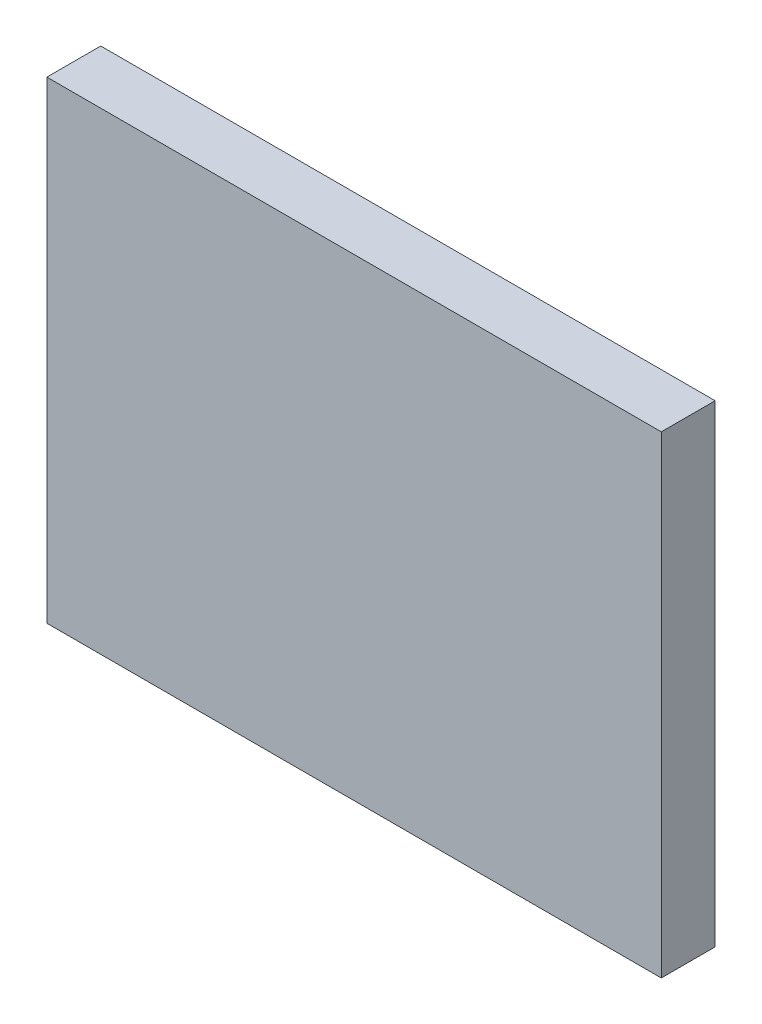
ISO-10303-21;
HEADER;
FILE_DESCRIPTION(('STEP AP214'),'2;1');
FILE_NAME('part.step','',(''),(''),'','','');
FILE_SCHEMA(('AUTOMOTIVE_DESIGN { 1 0 10303 214 1 1 1 1 }'));
ENDSEC;
DATA;
#1=APPLICATION_CONTEXT('core data for automotive mechanical design processes');
#2=APPLICATION_PROTOCOL_DEFINITION('international standard','automotive_design',2000,#1);
#3=PRODUCT_CONTEXT('',#1,'mechanical');
#4=PRODUCT('Part','Part','',(#3));
#5=PRODUCT_RELATED_PRODUCT_CATEGORY('part','',(#4));
#6=PRODUCT_DEFINITION_FORMATION('','',#4);
#7=PRODUCT_DEFINITION_CONTEXT('part definition',#1,'design');
#8=PRODUCT_DEFINITION('design','',#6,#7);
#9=PRODUCT_DEFINITION_SHAPE('','',#8);
#10=(LENGTH_UNIT() NAMED_UNIT(*) SI_UNIT(.MILLI.,.METRE.));
#11=(NAMED_UNIT(*) PLANE_ANGLE_UNIT() SI_UNIT($,.RADIAN.));
#12=(NAMED_UNIT(*) SI_UNIT($,.STERADIAN.) SOLID_ANGLE_UNIT());
#13=UNCERTAINTY_MEASURE_WITH_UNIT(LENGTH_MEASURE(1.E-05),#10,'distance_accuracy_value','');
#14=(GEOMETRIC_REPRESENTATION_CONTEXT(3) GLOBAL_UNCERTAINTY_ASSIGNED_CONTEXT((#13)) GLOBAL_UNIT_ASSIGNED_CONTEXT((#10,
#11,#12)) REPRESENTATION_CONTEXT('',''));
#15=CARTESIAN_POINT('',(0.,0.,0.));
#16=DIRECTION('',(0.,0.,1.));
#17=DIRECTION('',(1.,0.,0.));
#18=AXIS2_PLACEMENT_3D('',#15,#16,#17);
#19=CARTESIAN_POINT('',(57.0327334451584,43.9077528089888,10.));
#20=DIRECTION('',(-1.,0.,0.));
#21=DIRECTION('',(0.,0.,1.));
#22=AXIS2_PLACEMENT_3D('',#19,#20,#21);
#23=PLANE('',#22);
#24=DIRECTION('',(0.,1.,0.));
#25=VECTOR('',#24,1.);
#26=CARTESIAN_POINT('',(57.0327334451584,43.9077528089888,0.));
#27=LINE('',#26,#25);
#28=CARTESIAN_POINT('',(57.0327334451584,-43.9077528089888,0.));
#29=VERTEX_POINT('',#28);
#30=CARTESIAN_POINT('',(57.0327334451584,43.9077528089888,0.));
#31=VERTEX_POINT('',#30);
#32=EDGE_CURVE('E96',#29,#31,#27,.T.);
#33=ORIENTED_EDGE('',*,*,#32,.T.);
#34=DIRECTION('',(0.,0.,-1.));
#35=VECTOR('',#34,1.);
#36=CARTESIAN_POINT('',(57.0327334451584,43.9077528089888,10.));
#37=LINE('',#36,#35);
#38=CARTESIAN_POINT('',(57.0327334451584,43.9077528089888,10.));
#39=VERTEX_POINT('',#38);
#40=EDGE_CURVE('E11',#39,#31,#37,.T.);
#41=ORIENTED_EDGE('',*,*,#40,.F.);
#42=DIRECTION('',(0.,1.,0.));
#43=VECTOR('',#42,1.);
#44=CARTESIAN_POINT('',(57.0327334451584,43.9077528089888,10.));
#45=LINE('',#44,#43);
#46=CARTESIAN_POINT('',(57.0327334451584,-43.9077528089888,10.));
#47=VERTEX_POINT('',#46);
#48=EDGE_CURVE('E84',#47,#39,#45,.T.);
#49=ORIENTED_EDGE('',*,*,#48,.F.);
#50=DIRECTION('',(0.,0.,-1.));
#51=VECTOR('',#50,1.);
#52=CARTESIAN_POINT('',(57.0327334451584,-43.9077528089888,10.));
#53=LINE('',#52,#51);
#54=EDGE_CURVE('E92',#47,#29,#53,.T.);
#55=ORIENTED_EDGE('',*,*,#54,.T.);
#56=EDGE_LOOP('',(#33,#41,#49,#55));
#57=FACE_BOUND('',#56,.T.);
#58=ADVANCED_FACE('F33',(#57),#23,.F.);
#59=CARTESIAN_POINT('',(-57.0327334451584,43.9077528089888,10.));
#60=DIRECTION('',(0.,-1.,0.));
#61=DIRECTION('',(0.,0.,-1.));
#62=AXIS2_PLACEMENT_3D('',#59,#60,#61);
#63=PLANE('',#62);
#64=DIRECTION('',(-1.,0.,0.));
#65=VECTOR('',#64,1.);
#66=CARTESIAN_POINT('',(-57.0327334451584,43.9077528089888,0.));
#67=LINE('',#66,#65);
#68=CARTESIAN_POINT('',(-57.0327334451584,43.9077528089888,0.));
#69=VERTEX_POINT('',#68);
#70=EDGE_CURVE('E88',#31,#69,#67,.T.);
#71=ORIENTED_EDGE('',*,*,#70,.T.);
#72=DIRECTION('',(0.,0.,-1.));
#73=VECTOR('',#72,1.);
#74=CARTESIAN_POINT('',(-57.0327334451584,43.9077528089888,10.));
#75=LINE('',#74,#73);
#76=CARTESIAN_POINT('',(-57.0327334451584,43.9077528089888,10.));
#77=VERTEX_POINT('',#76);
#78=EDGE_CURVE('E41',#77,#69,#75,.T.);
#79=ORIENTED_EDGE('',*,*,#78,.F.);
#80=DIRECTION('',(-1.,0.,0.));
#81=VECTOR('',#80,1.);
#82=CARTESIAN_POINT('',(-57.0327334451584,43.9077528089888,10.));
#83=LINE('',#82,#81);
#84=EDGE_CURVE('E79',#39,#77,#83,.T.);
#85=ORIENTED_EDGE('',*,*,#84,.F.);
#86=ORIENTED_EDGE('',*,*,#40,.T.);
#87=EDGE_LOOP('',(#71,#79,#85,#86));
#88=FACE_BOUND('',#87,.T.);
#89=ADVANCED_FACE('F87',(#88),#63,.F.);
#90=CARTESIAN_POINT('',(-57.0327334451584,43.9077528089888,10.));
#91=DIRECTION('',(1.,0.,0.));
#92=DIRECTION('',(0.,0.,-1.));
#93=AXIS2_PLACEMENT_3D('',#90,#91,#92);
#94=PLANE('',#93);
#95=DIRECTION('',(0.,-1.,0.));
#96=VECTOR('',#95,1.);
#97=CARTESIAN_POINT('',(-57.0327334451584,43.9077528089888,0.));
#98=LINE('',#97,#96);
#99=CARTESIAN_POINT('',(-57.0327334451584,-43.9077528089888,0.));
#100=VERTEX_POINT('',#99);
#101=EDGE_CURVE('E66',#69,#100,#98,.T.);
#102=ORIENTED_EDGE('',*,*,#101,.T.);
#103=DIRECTION('',(0.,0.,-1.));
#104=VECTOR('',#103,1.);
#105=CARTESIAN_POINT('',(-57.0327334451584,-43.9077528089888,10.));
#106=LINE('',#105,#104);
#107=CARTESIAN_POINT('',(-57.0327334451584,-43.9077528089888,10.));
#108=VERTEX_POINT('',#107);
#109=EDGE_CURVE('E89',#108,#100,#106,.T.);
#110=ORIENTED_EDGE('',*,*,#109,.F.);
#111=DIRECTION('',(0.,-1.,0.));
#112=VECTOR('',#111,1.);
#113=CARTESIAN_POINT('',(-57.0327334451584,43.9077528089888,10.));
#114=LINE('',#113,#112);
#115=EDGE_CURVE('E82',#77,#108,#114,.T.);
#116=ORIENTED_EDGE('',*,*,#115,.F.);
#117=ORIENTED_EDGE('',*,*,#78,.T.);
#118=EDGE_LOOP('',(#102,#110,#116,#117));
#119=FACE_BOUND('',#118,.T.);
#120=ADVANCED_FACE('F90',(#119),#94,.F.);
#121=CARTESIAN_POINT('',(-57.0327334451584,-43.9077528089888,10.));
#122=DIRECTION('',(0.,1.,0.));
#123=DIRECTION('',(0.,0.,1.));
#124=AXIS2_PLACEMENT_3D('',#121,#122,#123);
#125=PLANE('',#124);
#126=DIRECTION('',(1.,0.,0.));
#127=VECTOR('',#126,1.);
#128=CARTESIAN_POINT('',(-57.0327334451584,-43.9077528089888,0.));
#129=LINE('',#128,#127);
#130=EDGE_CURVE('E72',#100,#29,#129,.T.);
#131=ORIENTED_EDGE('',*,*,#130,.T.);
#132=ORIENTED_EDGE('',*,*,#54,.F.);
#133=DIRECTION('',(1.,0.,0.));
#134=VECTOR('',#133,1.);
#135=CARTESIAN_POINT('',(-57.0327334451584,-43.9077528089888,10.));
#136=LINE('',#135,#134);
#137=EDGE_CURVE('E49',#108,#47,#136,.T.);
#138=ORIENTED_EDGE('',*,*,#137,.F.);
#139=ORIENTED_EDGE('',*,*,#109,.T.);
#140=EDGE_LOOP('',(#131,#132,#138,#139));
#141=FACE_BOUND('',#140,.T.);
#142=ADVANCED_FACE('F103',(#141),#125,.F.);
#143=CARTESIAN_POINT('',(0.,0.,10.));
#144=DIRECTION('',(0.,0.,1.));
#145=DIRECTION('',(1.,0.,0.));
#146=AXIS2_PLACEMENT_3D('',#143,#144,#145);
#147=PLANE('',#146);
#148=ORIENTED_EDGE('',*,*,#48,.T.);
#149=ORIENTED_EDGE('',*,*,#84,.T.);
#150=ORIENTED_EDGE('',*,*,#115,.T.);
#151=ORIENTED_EDGE('',*,*,#137,.T.);
#152=EDGE_LOOP('',(#148,#149,#150,#151));
#153=FACE_BOUND('',#152,.T.);
#154=ADVANCED_FACE('F80',(#153),#147,.T.);
#155=CARTESIAN_POINT('',(0.,0.,0.));
#156=DIRECTION('',(0.,0.,1.));
#157=DIRECTION('',(1.,0.,0.));
#158=AXIS2_PLACEMENT_3D('',#155,#156,#157);
#159=PLANE('',#158);
#160=ORIENTED_EDGE('',*,*,#32,.F.);
#161=ORIENTED_EDGE('',*,*,#130,.F.);
#162=ORIENTED_EDGE('',*,*,#101,.F.);
#163=ORIENTED_EDGE('',*,*,#70,.F.);
#164=EDGE_LOOP('',(#160,#161,#162,#163));
#165=FACE_BOUND('',#164,.T.);
#166=ADVANCED_FACE('F106',(#165),#159,.F.);
#167=CLOSED_SHELL('',(#58,#89,#120,#142,#154,#166));
#168=MANIFOLD_SOLID_BREP('B2',#167);
#169=ADVANCED_BREP_SHAPE_REPRESENTATION('',(#18,#168),#14);
#170=SHAPE_DEFINITION_REPRESENTATION(#9,#169);
ENDSEC;
END-ISO-10303-21;
